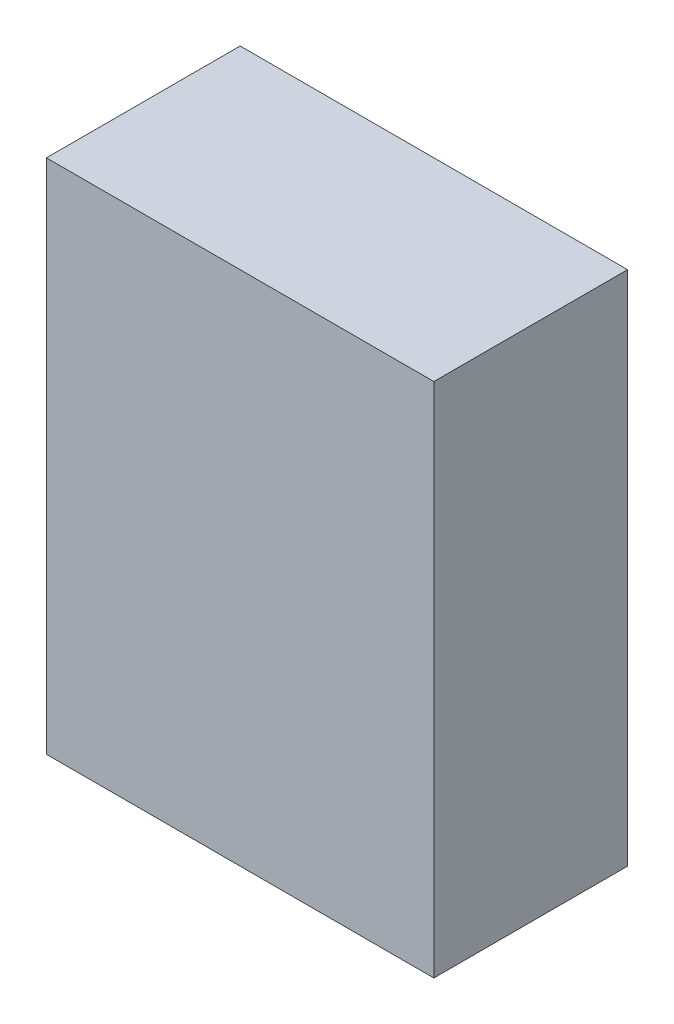
ISO-10303-21;
HEADER;
FILE_DESCRIPTION(('STEP AP214'),'2;1');
FILE_NAME('part.step','',(''),(''),'','','');
FILE_SCHEMA(('AUTOMOTIVE_DESIGN { 1 0 10303 214 1 1 1 1 }'));
ENDSEC;
DATA;
#1=APPLICATION_CONTEXT('core data for automotive mechanical design processes');
#2=APPLICATION_PROTOCOL_DEFINITION('international standard','automotive_design',2000,#1);
#3=PRODUCT_CONTEXT('',#1,'mechanical');
#4=PRODUCT('Part','Part','',(#3));
#5=PRODUCT_RELATED_PRODUCT_CATEGORY('part','',(#4));
#6=PRODUCT_DEFINITION_FORMATION('','',#4);
#7=PRODUCT_DEFINITION_CONTEXT('part definition',#1,'design');
#8=PRODUCT_DEFINITION('design','',#6,#7);
#9=PRODUCT_DEFINITION_SHAPE('','',#8);
#10=(LENGTH_UNIT() NAMED_UNIT(*) SI_UNIT(.MILLI.,.METRE.));
#11=(NAMED_UNIT(*) PLANE_ANGLE_UNIT() SI_UNIT($,.RADIAN.));
#12=(NAMED_UNIT(*) SI_UNIT($,.STERADIAN.) SOLID_ANGLE_UNIT());
#13=UNCERTAINTY_MEASURE_WITH_UNIT(LENGTH_MEASURE(1.E-05),#10,'distance_accuracy_value','');
#14=(GEOMETRIC_REPRESENTATION_CONTEXT(3) GLOBAL_UNCERTAINTY_ASSIGNED_CONTEXT((#13)) GLOBAL_UNIT_ASSIGNED_CONTEXT((#10,
#11,#12)) REPRESENTATION_CONTEXT('',''));
#15=CARTESIAN_POINT('',(0.,0.,0.));
#16=DIRECTION('',(0.,0.,1.));
#17=DIRECTION('',(1.,0.,0.));
#18=AXIS2_PLACEMENT_3D('',#15,#16,#17);
#19=CARTESIAN_POINT('',(-1.125,-1.2,0.));
#20=DIRECTION('',(-1.,0.,0.));
#21=DIRECTION('',(0.,-1.,0.));
#22=AXIS2_PLACEMENT_3D('',#19,#20,#21);
#23=PLANE('',#22);
#24=DIRECTION('',(0.,-1.,0.));
#25=VECTOR('',#24,1.);
#26=CARTESIAN_POINT('',(-1.125,-1.2,0.));
#27=LINE('',#26,#25);
#28=CARTESIAN_POINT('',(-1.125,-1.2,0.));
#29=VERTEX_POINT('',#28);
#30=CARTESIAN_POINT('',(-1.125,-1.6,0.));
#31=VERTEX_POINT('',#30);
#32=EDGE_CURVE('E11',#29,#31,#27,.T.);
#33=ORIENTED_EDGE('',*,*,#32,.T.);
#34=DIRECTION('',(0.,0.,1.));
#35=VECTOR('',#34,1.);
#36=CARTESIAN_POINT('',(-1.125,-1.6,0.));
#37=LINE('',#36,#35);
#38=CARTESIAN_POINT('',(-1.125,-1.6,0.15));
#39=VERTEX_POINT('',#38);
#40=EDGE_CURVE('E24',#31,#39,#37,.T.);
#41=ORIENTED_EDGE('',*,*,#40,.T.);
#42=DIRECTION('',(0.,-1.,0.));
#43=VECTOR('',#42,1.);
#44=CARTESIAN_POINT('',(-1.125,-1.2,0.15));
#45=LINE('',#44,#43);
#46=CARTESIAN_POINT('',(-1.125,-1.2,0.15));
#47=VERTEX_POINT('',#46);
#48=EDGE_CURVE('E75',#47,#39,#45,.T.);
#49=ORIENTED_EDGE('',*,*,#48,.F.);
#50=DIRECTION('',(0.,0.,1.));
#51=VECTOR('',#50,1.);
#52=CARTESIAN_POINT('',(-1.125,-1.2,0.));
#53=LINE('',#52,#51);
#54=EDGE_CURVE('E86',#29,#47,#53,.T.);
#55=ORIENTED_EDGE('',*,*,#54,.F.);
#56=EDGE_LOOP('',(#33,#41,#49,#55));
#57=FACE_BOUND('',#56,.T.);
#58=ADVANCED_FACE('F17',(#57),#23,.T.);
#59=CARTESIAN_POINT('',(-0.825,-1.2,0.));
#60=DIRECTION('',(0.,1.,0.));
#61=DIRECTION('',(-1.,0.,0.));
#62=AXIS2_PLACEMENT_3D('',#59,#60,#61);
#63=PLANE('',#62);
#64=DIRECTION('',(-1.,0.,0.));
#65=VECTOR('',#64,1.);
#66=CARTESIAN_POINT('',(-0.825,-1.2,0.));
#67=LINE('',#66,#65);
#68=CARTESIAN_POINT('',(-0.825,-1.2,0.));
#69=VERTEX_POINT('',#68);
#70=EDGE_CURVE('E83',#69,#29,#67,.T.);
#71=ORIENTED_EDGE('',*,*,#70,.T.);
#72=ORIENTED_EDGE('',*,*,#54,.T.);
#73=DIRECTION('',(-1.,0.,0.));
#74=VECTOR('',#73,1.);
#75=CARTESIAN_POINT('',(-0.825,-1.2,0.15));
#76=LINE('',#75,#74);
#77=CARTESIAN_POINT('',(-0.825,-1.2,0.15));
#78=VERTEX_POINT('',#77);
#79=EDGE_CURVE('E81',#78,#47,#76,.T.);
#80=ORIENTED_EDGE('',*,*,#79,.F.);
#81=DIRECTION('',(0.,0.,1.));
#82=VECTOR('',#81,1.);
#83=CARTESIAN_POINT('',(-0.825,-1.2,0.));
#84=LINE('',#83,#82);
#85=EDGE_CURVE('E61',#69,#78,#84,.T.);
#86=ORIENTED_EDGE('',*,*,#85,.F.);
#87=EDGE_LOOP('',(#71,#72,#80,#86));
#88=FACE_BOUND('',#87,.T.);
#89=ADVANCED_FACE('F91',(#88),#63,.T.);
#90=CARTESIAN_POINT('',(-0.825,-1.6,0.));
#91=DIRECTION('',(1.,0.,0.));
#92=DIRECTION('',(0.,1.,0.));
#93=AXIS2_PLACEMENT_3D('',#90,#91,#92);
#94=PLANE('',#93);
#95=DIRECTION('',(0.,1.,0.));
#96=VECTOR('',#95,1.);
#97=CARTESIAN_POINT('',(-0.825,-1.6,0.));
#98=LINE('',#97,#96);
#99=CARTESIAN_POINT('',(-0.825,-1.6,0.));
#100=VERTEX_POINT('',#99);
#101=EDGE_CURVE('E65',#100,#69,#98,.T.);
#102=ORIENTED_EDGE('',*,*,#101,.T.);
#103=ORIENTED_EDGE('',*,*,#85,.T.);
#104=DIRECTION('',(0.,1.,0.));
#105=VECTOR('',#104,1.);
#106=CARTESIAN_POINT('',(-0.825,-1.6,0.15));
#107=LINE('',#106,#105);
#108=CARTESIAN_POINT('',(-0.825,-1.6,0.15));
#109=VERTEX_POINT('',#108);
#110=EDGE_CURVE('E54',#109,#78,#107,.T.);
#111=ORIENTED_EDGE('',*,*,#110,.F.);
#112=DIRECTION('',(0.,0.,1.));
#113=VECTOR('',#112,1.);
#114=CARTESIAN_POINT('',(-0.825,-1.6,0.));
#115=LINE('',#114,#113);
#116=EDGE_CURVE('E58',#100,#109,#115,.T.);
#117=ORIENTED_EDGE('',*,*,#116,.F.);
#118=EDGE_LOOP('',(#102,#103,#111,#117));
#119=FACE_BOUND('',#118,.T.);
#120=ADVANCED_FACE('F57',(#119),#94,.T.);
#121=CARTESIAN_POINT('',(-1.125,-1.6,0.));
#122=DIRECTION('',(0.,-1.,0.));
#123=DIRECTION('',(1.,0.,0.));
#124=AXIS2_PLACEMENT_3D('',#121,#122,#123);
#125=PLANE('',#124);
#126=DIRECTION('',(1.,0.,0.));
#127=VECTOR('',#126,1.);
#128=CARTESIAN_POINT('',(-1.125,-1.6,0.));
#129=LINE('',#128,#127);
#130=EDGE_CURVE('E71',#31,#100,#129,.T.);
#131=ORIENTED_EDGE('',*,*,#130,.T.);
#132=ORIENTED_EDGE('',*,*,#116,.T.);
#133=DIRECTION('',(1.,0.,0.));
#134=VECTOR('',#133,1.);
#135=CARTESIAN_POINT('',(-1.125,-1.6,0.15));
#136=LINE('',#135,#134);
#137=EDGE_CURVE('E70',#39,#109,#136,.T.);
#138=ORIENTED_EDGE('',*,*,#137,.F.);
#139=ORIENTED_EDGE('',*,*,#40,.F.);
#140=EDGE_LOOP('',(#131,#132,#138,#139));
#141=FACE_BOUND('',#140,.T.);
#142=ADVANCED_FACE('F69',(#141),#125,.T.);
#143=CARTESIAN_POINT('',(-0.975,-1.4,0.15));
#144=DIRECTION('',(0.,0.,1.));
#145=DIRECTION('',(1.,0.,0.));
#146=AXIS2_PLACEMENT_3D('',#143,#144,#145);
#147=PLANE('',#146);
#148=ORIENTED_EDGE('',*,*,#137,.T.);
#149=ORIENTED_EDGE('',*,*,#110,.T.);
#150=ORIENTED_EDGE('',*,*,#79,.T.);
#151=ORIENTED_EDGE('',*,*,#48,.T.);
#152=EDGE_LOOP('',(#148,#149,#150,#151));
#153=FACE_BOUND('',#152,.T.);
#154=ADVANCED_FACE('F74',(#153),#147,.T.);
#155=CARTESIAN_POINT('',(-0.975,-1.4,0.));
#156=DIRECTION('',(0.,0.,1.));
#157=DIRECTION('',(1.,0.,0.));
#158=AXIS2_PLACEMENT_3D('',#155,#156,#157);
#159=PLANE('',#158);
#160=ORIENTED_EDGE('',*,*,#130,.F.);
#161=ORIENTED_EDGE('',*,*,#32,.F.);
#162=ORIENTED_EDGE('',*,*,#70,.F.);
#163=ORIENTED_EDGE('',*,*,#101,.F.);
#164=EDGE_LOOP('',(#160,#161,#162,#163));
#165=FACE_BOUND('',#164,.T.);
#166=ADVANCED_FACE('F89',(#165),#159,.F.);
#167=CLOSED_SHELL('',(#58,#89,#120,#142,#154,#166));
#168=MANIFOLD_SOLID_BREP('B1',#167);
#169=ADVANCED_BREP_SHAPE_REPRESENTATION('',(#18,#168),#14);
#170=SHAPE_DEFINITION_REPRESENTATION(#9,#169);
ENDSEC;
END-ISO-10303-21;
